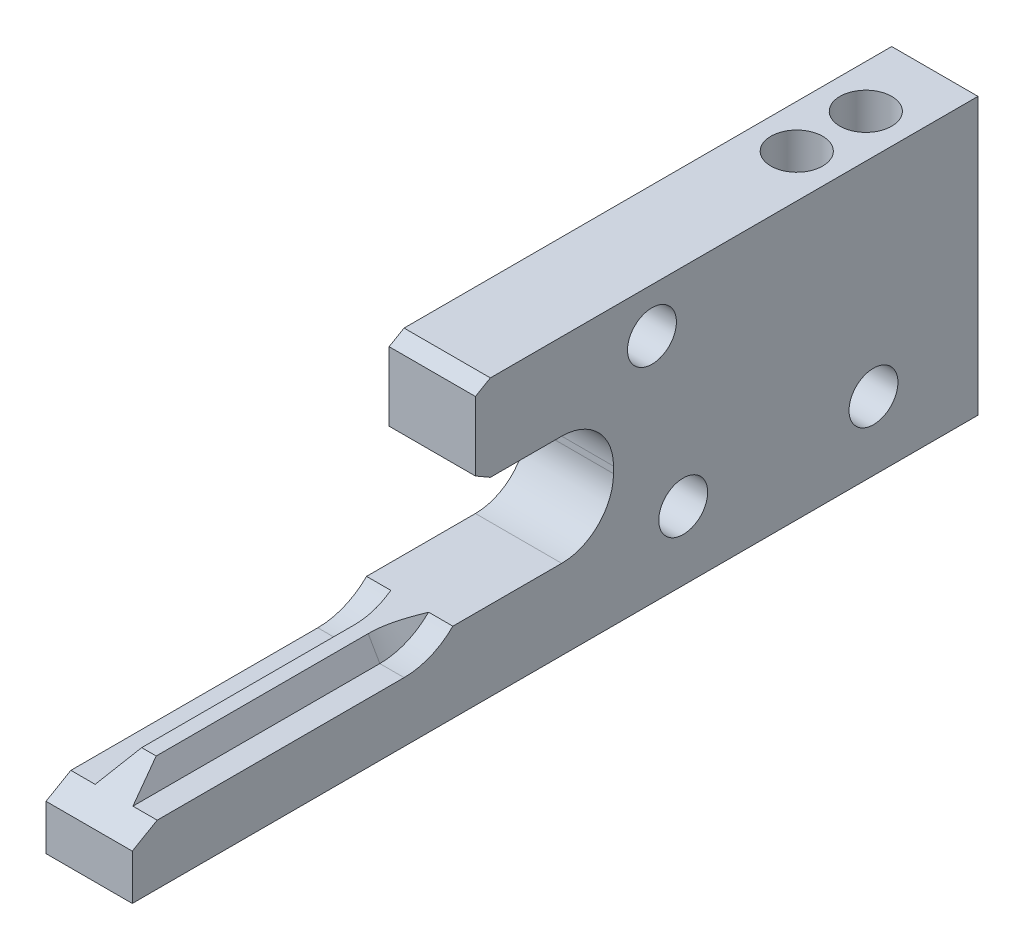
ISO-10303-21;
HEADER;
FILE_DESCRIPTION(('STEP AP214'),'2;1');
FILE_NAME('part.step','',(''),(''),'','','');
FILE_SCHEMA(('AUTOMOTIVE_DESIGN { 1 0 10303 214 1 1 1 1 }'));
ENDSEC;
DATA;
#1=APPLICATION_CONTEXT('core data for automotive mechanical design processes');
#2=APPLICATION_PROTOCOL_DEFINITION('international standard','automotive_design',2000,#1);
#3=PRODUCT_CONTEXT('',#1,'mechanical');
#4=PRODUCT('Part','Part','',(#3));
#5=PRODUCT_RELATED_PRODUCT_CATEGORY('part','',(#4));
#6=PRODUCT_DEFINITION_FORMATION('','',#4);
#7=PRODUCT_DEFINITION_CONTEXT('part definition',#1,'design');
#8=PRODUCT_DEFINITION('design','',#6,#7);
#9=PRODUCT_DEFINITION_SHAPE('','',#8);
#10=(LENGTH_UNIT() NAMED_UNIT(*) SI_UNIT(.MILLI.,.METRE.));
#11=(NAMED_UNIT(*) PLANE_ANGLE_UNIT() SI_UNIT($,.RADIAN.));
#12=(NAMED_UNIT(*) SI_UNIT($,.STERADIAN.) SOLID_ANGLE_UNIT());
#13=UNCERTAINTY_MEASURE_WITH_UNIT(LENGTH_MEASURE(1.E-05),#10,'distance_accuracy_value','');
#14=(GEOMETRIC_REPRESENTATION_CONTEXT(3) GLOBAL_UNCERTAINTY_ASSIGNED_CONTEXT((#13)) GLOBAL_UNIT_ASSIGNED_CONTEXT((#10,
#11,#12)) REPRESENTATION_CONTEXT('',''));
#15=CARTESIAN_POINT('',(0.,0.,0.));
#16=DIRECTION('',(0.,0.,1.));
#17=DIRECTION('',(1.,0.,0.));
#18=AXIS2_PLACEMENT_3D('',#15,#16,#17);
#19=CARTESIAN_POINT('',(15.875,14.6939,155.575));
#20=DIRECTION('',(0.,-1.,0.));
#21=DIRECTION('',(0.,0.,-1.));
#22=AXIS2_PLACEMENT_3D('',#19,#20,#21);
#23=PLANE('',#22);
#24=DIRECTION('',(0.,0.,1.));
#25=VECTOR('',#24,1.);
#26=CARTESIAN_POINT('',(6.604,14.6939,105.575));
#27=LINE('',#26,#25);
#28=CARTESIAN_POINT('',(6.604,14.6939,105.575));
#29=VERTEX_POINT('',#28);
#30=CARTESIAN_POINT('',(6.60400000000001,14.6939,144.576477371938));
#31=VERTEX_POINT('',#30);
#32=EDGE_CURVE('E726',#29,#31,#27,.T.);
#33=ORIENTED_EDGE('',*,*,#32,.T.);
#34=DIRECTION('',(1.,0.,0.));
#35=VECTOR('',#34,1.);
#36=CARTESIAN_POINT('',(0.,14.6939,144.576477371938));
#37=LINE('',#36,#35);
#38=CARTESIAN_POINT('',(9.271,14.6939,144.576477371938));
#39=VERTEX_POINT('',#38);
#40=EDGE_CURVE('E372',#31,#39,#37,.T.);
#41=ORIENTED_EDGE('',*,*,#40,.T.);
#42=DIRECTION('',(0.,0.,1.));
#43=VECTOR('',#42,1.);
#44=CARTESIAN_POINT('',(9.271,14.6939,105.575));
#45=LINE('',#44,#43);
#46=CARTESIAN_POINT('',(9.271,14.6939,105.575));
#47=VERTEX_POINT('',#46);
#48=EDGE_CURVE('E724',#47,#39,#45,.T.);
#49=ORIENTED_EDGE('',*,*,#48,.F.);
#50=CARTESIAN_POINT('',(16.3434941393958,14.6939,86.3304353971037));
#51=CARTESIAN_POINT('',(16.1054517664807,14.6939,86.7855798597903));
#52=CARTESIAN_POINT('',(15.8685486339507,14.6939,87.2413251005352));
#53=CARTESIAN_POINT('',(15.3976202622754,14.6939,88.154324569284));
#54=CARTESIAN_POINT('',(15.1635951498618,14.6939,88.6115788626214));
#55=CARTESIAN_POINT('',(14.6987226480085,14.6939,89.5284962898796));
#56=CARTESIAN_POINT('',(14.467880090142,14.6939,89.9881618773967));
#57=CARTESIAN_POINT('',(14.010555350619,14.6939,90.9096518370073));
#58=CARTESIAN_POINT('',(13.7840731043428,14.6939,91.371476176982));
#59=CARTESIAN_POINT('',(13.3217916243782,14.6939,92.3283690708705));
#60=CARTESIAN_POINT('',(13.0863653347386,14.6939,92.8236182730073));
#61=CARTESIAN_POINT('',(12.6235412772704,14.6939,93.817894843858));
#62=CARTESIAN_POINT('',(12.3961438566429,14.6939,94.3169223748318));
#63=CARTESIAN_POINT('',(11.952010980392,14.6939,95.3195379822649));
#64=CARTESIAN_POINT('',(11.7352723160888,14.6939,95.8231246315343));
#65=CARTESIAN_POINT('',(11.3159723297565,14.6939,96.8361720935029));
#66=CARTESIAN_POINT('',(11.1134096514921,14.6939,97.3456323388205));
#67=CARTESIAN_POINT('',(10.7983144421751,14.6939,98.1837116116901));
#68=CARTESIAN_POINT('',(10.6800017722808,14.6939,98.5101532601466));
#69=CARTESIAN_POINT('',(10.4528500570047,14.6939,99.1663062940015));
#70=CARTESIAN_POINT('',(10.3440102061598,14.6939,99.4960173987408));
#71=CARTESIAN_POINT('',(10.1378365669734,14.6939,100.159070790287));
#72=CARTESIAN_POINT('',(10.0405036492978,14.6939,100.492413349784));
#73=CARTESIAN_POINT('',(9.85977095270613,14.6939,101.162887883503));
#74=CARTESIAN_POINT('',(9.77637103109569,14.6939,101.500019818878));
#75=CARTESIAN_POINT('',(9.62812310629079,14.6939,102.169246626136));
#76=CARTESIAN_POINT('',(9.56285153636122,14.6939,102.501246662355));
#77=CARTESIAN_POINT('',(9.45057912040732,14.6939,103.168350853809));
#78=CARTESIAN_POINT('',(9.40357754113268,14.6939,103.503454883915));
#79=CARTESIAN_POINT('',(9.33004482338421,14.6939,104.175609512781));
#80=CARTESIAN_POINT('',(9.3034940881323,14.6939,104.512657935468));
#81=CARTESIAN_POINT('',(9.27218180838124,14.6939,105.187768517397));
#82=CARTESIAN_POINT('',(9.26741903074855,14.6939,105.525830618183));
#83=CARTESIAN_POINT('',(9.27930275906689,14.6939,106.167622191697));
#84=CARTESIAN_POINT('',(9.29384906959821,14.6939,106.471393050145));
#85=CARTESIAN_POINT('',(9.34012886324102,14.6939,107.077607427517));
#86=CARTESIAN_POINT('',(9.37186223490923,14.6939,107.380050955034));
#87=CARTESIAN_POINT('',(9.45126383323926,14.6939,107.983026524959));
#88=CARTESIAN_POINT('',(9.49894312162742,14.6939,108.283557092455));
#89=CARTESIAN_POINT('',(9.60854593138569,14.6939,108.881992063725));
#90=CARTESIAN_POINT('',(9.67046993011779,14.6939,109.179896379142));
#91=CARTESIAN_POINT('',(9.80884974523668,14.6939,109.782062409989));
#92=CARTESIAN_POINT('',(9.88569805881589,14.6939,110.086233189661));
#93=CARTESIAN_POINT('',(10.0506308319873,14.6939,110.691490262413));
#94=CARTESIAN_POINT('',(10.1387153878004,14.6939,110.992576529054));
#95=CARTESIAN_POINT('',(10.3243367933456,14.6939,111.591778918126));
#96=CARTESIAN_POINT('',(10.4218728400373,14.6939,111.889895290522));
#97=CARTESIAN_POINT('',(10.574115186197,14.6939,112.33501363906));
#98=CARTESIAN_POINT('',(10.6258515659768,14.6939,112.483041619903));
#99=CARTESIAN_POINT('',(10.7311399001807,14.6939,112.778450285213));
#100=CARTESIAN_POINT('',(10.7846918488178,14.6939,112.925830971743));
#101=CARTESIAN_POINT('',(10.9535586644632,14.6939,113.382537878622));
#102=CARTESIAN_POINT('',(11.0717180910607,14.6939,113.690814430242));
#103=CARTESIAN_POINT('',(11.3141298144179,14.6939,114.304969474873));
#104=CARTESIAN_POINT('',(11.4383824507938,14.6939,114.61084783311));
#105=CARTESIAN_POINT('',(11.6919847679599,14.6939,115.220548736705));
#106=CARTESIAN_POINT('',(11.8213354203943,14.6939,115.524370877106));
#107=CARTESIAN_POINT('',(12.0842935405807,14.6939,116.130170173938));
#108=CARTESIAN_POINT('',(12.2179011015661,14.6939,116.432147289786));
#109=CARTESIAN_POINT('',(12.6242800624897,14.6939,117.336141874688));
#110=CARTESIAN_POINT('',(12.9024090554513,14.6939,117.93575106326));
#111=CARTESIAN_POINT('',(13.4689046022364,14.6939,119.130006708118));
#112=CARTESIAN_POINT('',(13.7572701373196,14.6939,119.724653651013));
#113=CARTESIAN_POINT('',(14.3424458856195,14.6939,120.911847817826));
#114=CARTESIAN_POINT('',(14.639277554437,14.6939,121.504384443736));
#115=CARTESIAN_POINT('',(15.2387489252325,14.6939,122.686520883351));
#116=CARTESIAN_POINT('',(15.5413887495971,14.6939,123.276120634841));
#117=CARTESIAN_POINT('',(16.1510125463783,14.6939,124.452721950796));
#118=CARTESIAN_POINT('',(16.4579944512084,14.6939,125.039724587996));
#119=CARTESIAN_POINT('',(17.0754868791568,14.6939,126.211863211099));
#120=CARTESIAN_POINT('',(17.385997376622,14.6939,126.796999210532));
#121=CARTESIAN_POINT('',(18.2265667276517,14.6939,128.371843908391));
#122=CARTESIAN_POINT('',(18.7592549981493,14.6939,129.360148599985));
#123=CARTESIAN_POINT('',(19.8303791631326,14.6939,131.33380107874));
#124=CARTESIAN_POINT('',(20.3688158098285,14.6939,132.319148456759));
#125=CARTESIAN_POINT('',(21.4470019783699,14.6939,134.282352679942));
#126=CARTESIAN_POINT('',(21.9867295348616,14.6939,135.260221595784));
#127=CARTESIAN_POINT('',(22.7986150487096,14.6939,136.725658543039));
#128=CARTESIAN_POINT('',(23.0696059104641,14.6939,137.213873947031));
#129=CARTESIAN_POINT('',(23.6122747421494,14.6939,138.189922078901));
#130=CARTESIAN_POINT('',(23.8839527113472,14.6939,138.677754807187));
#131=CARTESIAN_POINT('',(24.1559291981345,14.6939,139.165421086488));
#132=B_SPLINE_CURVE_WITH_KNOTS('',3,(#50,#51,#52,#53,#54,#55,#56,#57,#58,#59,#60,#61,#62,#63,
#64,#65,#66,#67,#68,#69,#70,#71,#72,#73,#74,#75,#76,#77,#78,#79,#80,#81,#82,#83,#84,#85,#86,#87,
#88,#89,#90,#91,#92,#93,#94,#95,#96,#97,#98,#99,#100,#101,#102,#103,#104,#105,#106,#107,#108,
#109,#110,#111,#112,#113,#114,#115,#116,#117,#118,#119,#120,#121,#122,#123,#124,#125,#126,#127,
#128,#129,#130,#131),.UNSPECIFIED.,.F.,.F.,(4,2,2,2,2,2,2,2,2,2,2,2,2,2,2,2,2,2,2,2,2,2,2,2,2,2,
2,2,2,2,2,2,2,2,2,2,2,2,2,2,4),(0.,1.54090917195354,3.08188595556461,4.62498954429285,
6.16807024665801,7.81309232799242,9.45818545990249,11.1027802877931,12.7472175594096,
13.7887650909224,14.8302239741062,15.8717616083339,16.9132885750252,17.927911862955,
18.9424944256492,19.956103563,20.9696553323812,21.8815102854699,22.7933593260368,
23.7058422353952,24.6183557279038,25.559286947878,26.5002262260021,27.4410856277385,
27.9115018862325,28.381916645471,29.3722660174202,30.3626706511842,31.3532649703439,
32.3438810001244,34.3266476236101,36.3092174724153,38.2973592194643,40.2855429057825,
42.2728097741739,44.2600622043274,47.6281959828104,50.9967760402033,54.3475591099649,
56.0227043681855,57.6978478397403),.UNSPECIFIED.);
#133=CARTESIAN_POINT('',(11.4120457382628,14.6939,96.6061021056096));
#134=VERTEX_POINT('',#133);
#135=EDGE_CURVE('E422',#134,#47,#132,.T.);
#136=ORIENTED_EDGE('',*,*,#135,.F.);
#137=DIRECTION('',(1.,0.,0.));
#138=VECTOR('',#137,1.);
#139=CARTESIAN_POINT('',(15.875,14.6939,96.6061021056096));
#140=LINE('',#139,#138);
#141=CARTESIAN_POINT('',(15.875,14.6939,96.6061021056096));
#142=VERTEX_POINT('',#141);
#143=EDGE_CURVE('E207',#142,#134,#140,.F.);
#144=ORIENTED_EDGE('',*,*,#143,.F.);
#145=DIRECTION('',(0.,0.,1.));
#146=VECTOR('',#145,1.);
#147=CARTESIAN_POINT('',(15.875,14.6939,155.575));
#148=LINE('',#147,#146);
#149=CARTESIAN_POINT('',(15.875,14.6939,76.581));
#150=VERTEX_POINT('',#149);
#151=EDGE_CURVE('E185',#150,#142,#148,.T.);
#152=ORIENTED_EDGE('',*,*,#151,.F.);
#153=DIRECTION('',(-1.,0.,0.));
#154=VECTOR('',#153,1.);
#155=CARTESIAN_POINT('',(15.875,14.6939,76.581));
#156=LINE('',#155,#154);
#157=CARTESIAN_POINT('',(0.,14.6939,76.581));
#158=VERTEX_POINT('',#157);
#159=EDGE_CURVE('E193',#150,#158,#156,.T.);
#160=ORIENTED_EDGE('',*,*,#159,.T.);
#161=DIRECTION('',(0.,0.,1.));
#162=VECTOR('',#161,1.);
#163=CARTESIAN_POINT('',(0.,14.6939,155.575));
#164=LINE('',#163,#162);
#165=CARTESIAN_POINT('',(0.,14.6939,96.6061021056096));
#166=VERTEX_POINT('',#165);
#167=EDGE_CURVE('E234',#158,#166,#164,.T.);
#168=ORIENTED_EDGE('',*,*,#167,.T.);
#169=DIRECTION('',(1.,0.,0.));
#170=VECTOR('',#169,1.);
#171=CARTESIAN_POINT('',(15.875,14.6939,96.6061021056096));
#172=LINE('',#171,#170);
#173=CARTESIAN_POINT('',(4.46295426173719,14.6939,96.6061021056096));
#174=VERTEX_POINT('',#173);
#175=EDGE_CURVE('E310',#174,#166,#172,.F.);
#176=ORIENTED_EDGE('',*,*,#175,.F.);
#177=CARTESIAN_POINT('',(-0.468494139395891,14.6939,86.3304353971037));
#178=CARTESIAN_POINT('',(-0.230451766480791,14.6939,86.7855798597903));
#179=CARTESIAN_POINT('',(0.00645136604922203,14.6939,87.2413251005352));
#180=CARTESIAN_POINT('',(0.47737973772447,14.6939,88.154324569284));
#181=CARTESIAN_POINT('',(0.711404850138061,14.6939,88.6115788626214));
#182=CARTESIAN_POINT('',(1.17627735199139,14.6939,89.5284962898796));
#183=CARTESIAN_POINT('',(1.40711990985791,14.6939,89.9881618773966));
#184=CARTESIAN_POINT('',(1.86444464938095,14.6939,90.9096518370073));
#185=CARTESIAN_POINT('',(2.0909268956571,14.6939,91.371476176982));
#186=CARTESIAN_POINT('',(2.55320837562174,14.6939,92.3283690708705));
#187=CARTESIAN_POINT('',(2.78863466526133,14.6939,92.8236182730073));
#188=CARTESIAN_POINT('',(3.25145872272955,14.6939,93.817894843858));
#189=CARTESIAN_POINT('',(3.47885614335702,14.6939,94.3169223748317));
#190=CARTESIAN_POINT('',(3.9229890196079,14.6939,95.3195379822649));
#191=CARTESIAN_POINT('',(4.13972768391112,14.6939,95.8231246315343));
#192=CARTESIAN_POINT('',(4.55902767024343,14.6939,96.8361720935028));
#193=CARTESIAN_POINT('',(4.76159034850789,14.6939,97.3456323388205));
#194=CARTESIAN_POINT('',(5.07668555782483,14.6939,98.1837116116901));
#195=CARTESIAN_POINT('',(5.1949982277192,14.6939,98.5101532601466));
#196=CARTESIAN_POINT('',(5.42214994299523,14.6939,99.1663062940015));
#197=CARTESIAN_POINT('',(5.5309897938402,14.6939,99.4960173987407));
#198=CARTESIAN_POINT('',(5.73716343302655,14.6939,100.159070790287));
#199=CARTESIAN_POINT('',(5.8344963507022,14.6939,100.492413349784));
#200=CARTESIAN_POINT('',(6.01522904729385,14.6939,101.162887883503));
#201=CARTESIAN_POINT('',(6.09862896890429,14.6939,101.500019818878));
#202=CARTESIAN_POINT('',(6.24687689370919,14.6939,102.169246626136));
#203=CARTESIAN_POINT('',(6.31214846363876,14.6939,102.501246662355));
#204=CARTESIAN_POINT('',(6.42442087959267,14.6939,103.168350853809));
#205=CARTESIAN_POINT('',(6.47142245886731,14.6939,103.503454883915));
#206=CARTESIAN_POINT('',(6.54495517661578,14.6939,104.17560951278));
#207=CARTESIAN_POINT('',(6.57150591186769,14.6939,104.512657935468));
#208=CARTESIAN_POINT('',(6.60281819161876,14.6939,105.187768517396));
#209=CARTESIAN_POINT('',(6.60758096925145,14.6939,105.525830618183));
#210=CARTESIAN_POINT('',(6.59569724093312,14.6939,106.167622191697));
#211=CARTESIAN_POINT('',(6.58115093040179,14.6939,106.471393050145));
#212=CARTESIAN_POINT('',(6.53487113675899,14.6939,107.077607427517));
#213=CARTESIAN_POINT('',(6.50313776509078,14.6939,107.380050955034));
#214=CARTESIAN_POINT('',(6.42373616676075,14.6939,107.983026524959));
#215=CARTESIAN_POINT('',(6.3760568783726,14.6939,108.283557092454));
#216=CARTESIAN_POINT('',(6.26645406861432,14.6939,108.881992063725));
#217=CARTESIAN_POINT('',(6.20453006988222,14.6939,109.179896379142));
#218=CARTESIAN_POINT('',(6.06615025476334,14.6939,109.782062409988));
#219=CARTESIAN_POINT('',(5.98930194118412,14.6939,110.086233189661));
#220=CARTESIAN_POINT('',(5.82436916801272,14.6939,110.691490262413));
#221=CARTESIAN_POINT('',(5.73628461219963,14.6939,110.992576529054));
#222=CARTESIAN_POINT('',(5.55066320665439,14.6939,111.591778918126));
#223=CARTESIAN_POINT('',(5.45312715996276,14.6939,111.889895290522));
#224=CARTESIAN_POINT('',(5.30088481380299,14.6939,112.33501363906));
#225=CARTESIAN_POINT('',(5.24914843402319,14.6939,112.483041619902));
#226=CARTESIAN_POINT('',(5.14386009981934,14.6939,112.778450285213));
#227=CARTESIAN_POINT('',(5.0903081511822,14.6939,112.925830971743));
#228=CARTESIAN_POINT('',(4.92144133553688,14.6939,113.382537878621));
#229=CARTESIAN_POINT('',(4.80328190893932,14.6939,113.690814430242));
#230=CARTESIAN_POINT('',(4.56087018558211,14.6939,114.304969474873));
#231=CARTESIAN_POINT('',(4.43661754920625,14.6939,114.61084783311));
#232=CARTESIAN_POINT('',(4.18301523204016,14.6939,115.220548736705));
#233=CARTESIAN_POINT('',(4.05366457960574,14.6939,115.524370877106));
#234=CARTESIAN_POINT('',(3.79070645941939,14.6939,116.130170173937));
#235=CARTESIAN_POINT('',(3.65709889843399,14.6939,116.432147289785));
#236=CARTESIAN_POINT('',(3.25071993751033,14.6939,117.336141874688));
#237=CARTESIAN_POINT('',(2.97259094454876,14.6939,117.93575106326));
#238=CARTESIAN_POINT('',(2.40609539776371,14.6939,119.130006708118));
#239=CARTESIAN_POINT('',(2.11772986268048,14.6939,119.724653651012));
#240=CARTESIAN_POINT('',(1.53255411438064,14.6939,120.911847817826));
#241=CARTESIAN_POINT('',(1.23572244556308,14.6939,121.504384443735));
#242=CARTESIAN_POINT('',(0.636251074767604,14.6939,122.68652088335));
#243=CARTESIAN_POINT('',(0.333611250403015,14.6939,123.276120634841));
#244=CARTESIAN_POINT('',(-0.276012546378111,14.6939,124.452721950795));
#245=CARTESIAN_POINT('',(-0.582994451208284,14.6939,125.039724587995));
#246=CARTESIAN_POINT('',(-1.20048687915659,14.6939,126.211863211098));
#247=CARTESIAN_POINT('',(-1.51099737662179,14.6939,126.796999210532));
#248=CARTESIAN_POINT('',(-2.35156672765154,14.6939,128.37184390839));
#249=CARTESIAN_POINT('',(-2.8842549981491,14.6939,129.360148599984));
#250=CARTESIAN_POINT('',(-3.95537916313239,14.6939,131.333801078739));
#251=CARTESIAN_POINT('',(-4.49381580982826,14.6939,132.319148456758));
#252=CARTESIAN_POINT('',(-5.57200197836965,14.6939,134.282352679942));
#253=CARTESIAN_POINT('',(-6.11172953486135,14.6939,135.260221595783));
#254=CARTESIAN_POINT('',(-6.92361504870934,14.6939,136.725658543038));
#255=CARTESIAN_POINT('',(-7.19460591046379,14.6939,137.21387394703));
#256=CARTESIAN_POINT('',(-7.73727474214913,14.6939,138.1899220789));
#257=CARTESIAN_POINT('',(-8.00895271134688,14.6939,138.677754807186));
#258=CARTESIAN_POINT('',(-8.28092919813421,14.6939,139.165421086487));
#259=B_SPLINE_CURVE_WITH_KNOTS('',3,(#177,#178,#179,#180,#181,#182,#183,#184,#185,#186,#187,
#188,#189,#190,#191,#192,#193,#194,#195,#196,#197,#198,#199,#200,#201,#202,#203,#204,#205,#206,
#207,#208,#209,#210,#211,#212,#213,#214,#215,#216,#217,#218,#219,#220,#221,#222,#223,#224,#225,
#226,#227,#228,#229,#230,#231,#232,#233,#234,#235,#236,#237,#238,#239,#240,#241,#242,#243,#244,
#245,#246,#247,#248,#249,#250,#251,#252,#253,#254,#255,#256,#257,#258),.UNSPECIFIED.,.F.,.F.,(4,
2,2,2,2,2,2,2,2,2,2,2,2,2,2,2,2,2,2,2,2,2,2,2,2,2,2,2,2,2,2,2,2,2,2,2,2,2,2,2,4),(0.,
1.54090917195353,3.0818859555646,4.62498954429284,6.168070246658,7.81309232799238,
9.45818545990247,11.1027802877931,12.7472175594096,13.7887650909224,14.8302239741061,
15.8717616083339,16.9132885750252,17.927911862955,18.9424944256492,19.9561035629999,
20.9696553323811,21.8815102854698,22.7933593260367,23.7058422353951,24.6183557279037,
25.559286947878,26.500226226002,27.4410856277384,27.9115018862323,28.3819166454708,
29.37226601742,30.362670651184,31.3532649703437,32.3438810001242,34.3266476236098,
36.3092174724149,38.2973592194639,40.285542905782,42.2728097741733,44.2600622043268,
47.6281959828098,50.9967760402025,54.347559109964,56.0227043681846,57.6978478397393),.UNSPECIFIED.);
#260=EDGE_CURVE('E431',#29,#174,#259,.F.);
#261=ORIENTED_EDGE('',*,*,#260,.F.);
#262=EDGE_LOOP('',(#33,#41,#49,#136,#144,#152,#160,#168,#176,#261));
#263=FACE_BOUND('',#262,.T.);
#264=ADVANCED_FACE('F78',(#263),#23,.F.);
#265=CARTESIAN_POINT('',(15.875,24.2189,76.581));
#266=DIRECTION('',(1.,0.,0.));
#267=DIRECTION('',(0.,0.,-1.));
#268=AXIS2_PLACEMENT_3D('',#265,#266,#267);
#269=PLANE('',#268);
#270=DIRECTION('',(0.,0.499999999999996,-0.866025403784441));
#271=VECTOR('',#270,1.);
#272=CARTESIAN_POINT('',(15.875,8.34390000000003,155.575));
#273=LINE('',#272,#271);
#274=CARTESIAN_POINT('',(15.875,8.34390000000003,155.575));
#275=VERTEX_POINT('',#274);
#276=CARTESIAN_POINT('',(15.875,10.9855,150.999614586726));
#277=VERTEX_POINT('',#276);
#278=EDGE_CURVE('E366',#275,#277,#273,.T.);
#279=ORIENTED_EDGE('',*,*,#278,.F.);
#280=DIRECTION('',(0.,-1.,0.));
#281=VECTOR('',#280,1.);
#282=CARTESIAN_POINT('',(15.875,0.,155.575));
#283=LINE('',#282,#281);
#284=CARTESIAN_POINT('',(15.875,0.,155.575));
#285=VERTEX_POINT('',#284);
#286=EDGE_CURVE('E208',#275,#285,#283,.T.);
#287=ORIENTED_EDGE('',*,*,#286,.T.);
#288=DIRECTION('',(0.,0.,-1.));
#289=VECTOR('',#288,1.);
#290=CARTESIAN_POINT('',(15.875,0.,0.));
#291=LINE('',#290,#289);
#292=CARTESIAN_POINT('',(15.875,0.,0.));
#293=VERTEX_POINT('',#292);
#294=EDGE_CURVE('E101',#285,#293,#291,.T.);
#295=ORIENTED_EDGE('',*,*,#294,.T.);
#296=DIRECTION('',(0.,1.,0.));
#297=VECTOR('',#296,1.);
#298=CARTESIAN_POINT('',(15.875,50.8,0.));
#299=LINE('',#298,#297);
#300=CARTESIAN_POINT('',(15.875,50.8,0.));
#301=VERTEX_POINT('',#300);
#302=EDGE_CURVE('E239',#293,#301,#299,.T.);
#303=ORIENTED_EDGE('',*,*,#302,.T.);
#304=DIRECTION('',(0.,0.,1.));
#305=VECTOR('',#304,1.);
#306=CARTESIAN_POINT('',(15.875,50.8,89.7063693429844));
#307=LINE('',#306,#305);
#308=CARTESIAN_POINT('',(15.875,50.8,89.7063693429844));
#309=VERTEX_POINT('',#308);
#310=EDGE_CURVE('E152',#301,#309,#307,.T.);
#311=ORIENTED_EDGE('',*,*,#310,.T.);
#312=DIRECTION('',(0.,-0.500000000000001,0.866025403784438));
#313=VECTOR('',#312,1.);
#314=CARTESIAN_POINT('',(15.875,49.2125,92.456));
#315=LINE('',#314,#313);
#316=CARTESIAN_POINT('',(15.875,49.2125,92.456));
#317=VERTEX_POINT('',#316);
#318=EDGE_CURVE('E282',#309,#317,#315,.T.);
#319=ORIENTED_EDGE('',*,*,#318,.T.);
#320=DIRECTION('',(0.,-1.,0.));
#321=VECTOR('',#320,1.);
#322=CARTESIAN_POINT('',(15.875,36.5379,92.456));
#323=LINE('',#322,#321);
#324=CARTESIAN_POINT('',(15.875,36.5379,92.456));
#325=VERTEX_POINT('',#324);
#326=EDGE_CURVE('E279',#317,#325,#323,.T.);
#327=ORIENTED_EDGE('',*,*,#326,.T.);
#328=DIRECTION('',(0.,-0.499999999999999,-0.866025403784439));
#329=VECTOR('',#328,1.);
#330=CARTESIAN_POINT('',(15.875,34.9504,89.7063693429844));
#331=LINE('',#330,#329);
#332=CARTESIAN_POINT('',(15.875,34.9504,89.7063693429844));
#333=VERTEX_POINT('',#332);
#334=EDGE_CURVE('E281',#325,#333,#331,.T.);
#335=ORIENTED_EDGE('',*,*,#334,.T.);
#336=DIRECTION('',(0.,0.,-1.));
#337=VECTOR('',#336,1.);
#338=CARTESIAN_POINT('',(15.875,34.9504,76.581));
#339=LINE('',#338,#337);
#340=CARTESIAN_POINT('',(15.875,34.9504,76.581));
#341=VERTEX_POINT('',#340);
#342=EDGE_CURVE('E284',#333,#341,#339,.T.);
#343=ORIENTED_EDGE('',*,*,#342,.T.);
#344=CARTESIAN_POINT('',(15.875,25.4254,76.581));
#345=DIRECTION('',(-1.,0.,0.));
#346=DIRECTION('',(0.,0.,-1.));
#347=AXIS2_PLACEMENT_3D('',#344,#345,#346);
#348=CIRCLE('',#347,9.525);
#349=CARTESIAN_POINT('',(15.875,25.4254,67.056));
#350=VERTEX_POINT('',#349);
#351=EDGE_CURVE('E290',#341,#350,#348,.T.);
#352=ORIENTED_EDGE('',*,*,#351,.T.);
#353=DIRECTION('',(0.,-1.,0.));
#354=VECTOR('',#353,1.);
#355=CARTESIAN_POINT('',(15.875,24.2189,67.056));
#356=LINE('',#355,#354);
#357=CARTESIAN_POINT('',(15.875,24.2189,67.056));
#358=VERTEX_POINT('',#357);
#359=EDGE_CURVE('E187',#350,#358,#356,.T.);
#360=ORIENTED_EDGE('',*,*,#359,.T.);
#361=CARTESIAN_POINT('',(15.875,24.2189,76.581));
#362=DIRECTION('',(-1.,0.,0.));
#363=DIRECTION('',(0.,0.,-1.));
#364=AXIS2_PLACEMENT_3D('',#361,#362,#363);
#365=CIRCLE('',#364,9.525);
#366=EDGE_CURVE('E177',#358,#150,#365,.T.);
#367=ORIENTED_EDGE('',*,*,#366,.T.);
#368=ORIENTED_EDGE('',*,*,#151,.T.);
#369=CARTESIAN_POINT('',(15.875,23.6855,105.575));
#370=DIRECTION('',(1.,0.,0.));
#371=DIRECTION('',(0.,0.,-1.));
#372=AXIS2_PLACEMENT_3D('',#369,#370,#371);
#373=CIRCLE('',#372,12.7);
#374=CARTESIAN_POINT('',(15.875,10.9855,105.575));
#375=VERTEX_POINT('',#374);
#376=EDGE_CURVE('E413',#375,#142,#373,.T.);
#377=ORIENTED_EDGE('',*,*,#376,.F.);
#378=DIRECTION('',(0.,0.,1.));
#379=VECTOR('',#378,1.);
#380=CARTESIAN_POINT('',(15.875,10.9855,105.575));
#381=LINE('',#380,#379);
#382=EDGE_CURVE('E219',#375,#277,#381,.T.);
#383=ORIENTED_EDGE('',*,*,#382,.T.);
#384=EDGE_LOOP('',(#279,#287,#295,#303,#311,#319,#327,#335,#343,#352,#360,#367,#368,#377,#383));
#385=FACE_BOUND('',#384,.T.);
#386=CARTESIAN_POINT('',(15.875,42.60999987,59.980000078));
#387=DIRECTION('',(1.,0.,0.));
#388=DIRECTION('',(0.,0.,-1.));
#389=AXIS2_PLACEMENT_3D('',#386,#387,#388);
#390=CIRCLE('',#389,4.5);
#391=CARTESIAN_POINT('',(15.875,42.60999987,55.480000078));
#392=VERTEX_POINT('',#391);
#393=EDGE_CURVE('E383',#392,#392,#390,.T.);
#394=ORIENTED_EDGE('',*,*,#393,.F.);
#395=EDGE_LOOP('',(#394));
#396=FACE_BOUND('',#395,.T.);
#397=CARTESIAN_POINT('',(15.875,12.609999896,19.230000076));
#398=DIRECTION('',(1.,0.,0.));
#399=DIRECTION('',(0.,0.,-1.));
#400=AXIS2_PLACEMENT_3D('',#397,#398,#399);
#401=CIRCLE('',#400,4.5);
#402=CARTESIAN_POINT('',(15.875,12.609999896,14.730000076));
#403=VERTEX_POINT('',#402);
#404=EDGE_CURVE('E387',#403,#403,#401,.T.);
#405=ORIENTED_EDGE('',*,*,#404,.F.);
#406=EDGE_LOOP('',(#405));
#407=FACE_BOUND('',#406,.T.);
#408=CARTESIAN_POINT('',(15.875,12.609999896,54.230000076));
#409=DIRECTION('',(1.,0.,0.));
#410=DIRECTION('',(0.,0.,-1.));
#411=AXIS2_PLACEMENT_3D('',#408,#409,#410);
#412=CIRCLE('',#411,4.5);
#413=CARTESIAN_POINT('',(15.875,12.609999896,49.730000076));
#414=VERTEX_POINT('',#413);
#415=EDGE_CURVE('E393',#414,#414,#412,.T.);
#416=ORIENTED_EDGE('',*,*,#415,.F.);
#417=EDGE_LOOP('',(#416));
#418=FACE_BOUND('',#417,.T.);
#419=ADVANCED_FACE('F180',(#385,#396,#407,#418),#269,.T.);
#420=CARTESIAN_POINT('',(0.,24.2189,76.581));
#421=DIRECTION('',(1.,0.,0.));
#422=DIRECTION('',(0.,0.,-1.));
#423=AXIS2_PLACEMENT_3D('',#420,#421,#422);
#424=PLANE('',#423);
#425=CARTESIAN_POINT('',(0.,42.60999987,59.980000078));
#426=DIRECTION('',(1.,0.,0.));
#427=DIRECTION('',(0.,0.,-1.));
#428=AXIS2_PLACEMENT_3D('',#425,#426,#427);
#429=CIRCLE('',#428,4.5);
#430=CARTESIAN_POINT('',(0.,42.60999987,55.480000078));
#431=VERTEX_POINT('',#430);
#432=EDGE_CURVE('E384',#431,#431,#429,.T.);
#433=ORIENTED_EDGE('',*,*,#432,.T.);
#434=EDGE_LOOP('',(#433));
#435=FACE_BOUND('',#434,.T.);
#436=CARTESIAN_POINT('',(0.,12.609999896,19.230000076));
#437=DIRECTION('',(1.,0.,0.));
#438=DIRECTION('',(0.,0.,-1.));
#439=AXIS2_PLACEMENT_3D('',#436,#437,#438);
#440=CIRCLE('',#439,4.5);
#441=CARTESIAN_POINT('',(0.,12.609999896,14.730000076));
#442=VERTEX_POINT('',#441);
#443=EDGE_CURVE('E390',#442,#442,#440,.T.);
#444=ORIENTED_EDGE('',*,*,#443,.T.);
#445=EDGE_LOOP('',(#444));
#446=FACE_BOUND('',#445,.T.);
#447=CARTESIAN_POINT('',(0.,12.609999896,54.230000076));
#448=DIRECTION('',(1.,0.,0.));
#449=DIRECTION('',(0.,0.,-1.));
#450=AXIS2_PLACEMENT_3D('',#447,#448,#449);
#451=CIRCLE('',#450,4.5);
#452=CARTESIAN_POINT('',(0.,12.609999896,49.730000076));
#453=VERTEX_POINT('',#452);
#454=EDGE_CURVE('E396',#453,#453,#451,.T.);
#455=ORIENTED_EDGE('',*,*,#454,.T.);
#456=EDGE_LOOP('',(#455));
#457=FACE_BOUND('',#456,.T.);
#458=DIRECTION('',(0.,-1.,0.));
#459=VECTOR('',#458,1.);
#460=CARTESIAN_POINT('',(0.,0.,155.575));
#461=LINE('',#460,#459);
#462=CARTESIAN_POINT('',(0.,8.34390000000003,155.575));
#463=VERTEX_POINT('',#462);
#464=CARTESIAN_POINT('',(0.,0.,155.575));
#465=VERTEX_POINT('',#464);
#466=EDGE_CURVE('E236',#463,#465,#461,.T.);
#467=ORIENTED_EDGE('',*,*,#466,.F.);
#468=DIRECTION('',(0.,0.499999999999996,-0.866025403784441));
#469=VECTOR('',#468,1.);
#470=CARTESIAN_POINT('',(0.,8.34390000000003,155.575));
#471=LINE('',#470,#469);
#472=CARTESIAN_POINT('',(0.,10.9855,150.999614586726));
#473=VERTEX_POINT('',#472);
#474=EDGE_CURVE('E359',#463,#473,#471,.T.);
#475=ORIENTED_EDGE('',*,*,#474,.T.);
#476=DIRECTION('',(0.,0.,1.));
#477=VECTOR('',#476,1.);
#478=CARTESIAN_POINT('',(0.,10.9855,105.575));
#479=LINE('',#478,#477);
#480=CARTESIAN_POINT('',(0.,10.9855,105.575));
#481=VERTEX_POINT('',#480);
#482=EDGE_CURVE('E736',#481,#473,#479,.T.);
#483=ORIENTED_EDGE('',*,*,#482,.F.);
#484=CARTESIAN_POINT('',(0.,23.6855,105.575));
#485=DIRECTION('',(1.,0.,0.));
#486=DIRECTION('',(0.,0.,-1.));
#487=AXIS2_PLACEMENT_3D('',#484,#485,#486);
#488=CIRCLE('',#487,12.7);
#489=EDGE_CURVE('E305',#481,#166,#488,.T.);
#490=ORIENTED_EDGE('',*,*,#489,.T.);
#491=ORIENTED_EDGE('',*,*,#167,.F.);
#492=CARTESIAN_POINT('',(0.,24.2189,76.581));
#493=DIRECTION('',(-1.,0.,0.));
#494=DIRECTION('',(0.,0.,-1.));
#495=AXIS2_PLACEMENT_3D('',#492,#493,#494);
#496=CIRCLE('',#495,9.525);
#497=CARTESIAN_POINT('',(0.,24.2189,67.056));
#498=VERTEX_POINT('',#497);
#499=EDGE_CURVE('E196',#498,#158,#496,.T.);
#500=ORIENTED_EDGE('',*,*,#499,.F.);
#501=DIRECTION('',(0.,-1.,0.));
#502=VECTOR('',#501,1.);
#503=CARTESIAN_POINT('',(0.,24.2189,67.056));
#504=LINE('',#503,#502);
#505=CARTESIAN_POINT('',(0.,25.4254,67.056));
#506=VERTEX_POINT('',#505);
#507=EDGE_CURVE('E231',#506,#498,#504,.T.);
#508=ORIENTED_EDGE('',*,*,#507,.F.);
#509=CARTESIAN_POINT('',(0.,25.4254,76.581));
#510=DIRECTION('',(-1.,0.,0.));
#511=DIRECTION('',(0.,0.,-1.));
#512=AXIS2_PLACEMENT_3D('',#509,#510,#511);
#513=CIRCLE('',#512,9.525);
#514=CARTESIAN_POINT('',(0.,34.9504,76.581));
#515=VERTEX_POINT('',#514);
#516=EDGE_CURVE('E229',#515,#506,#513,.T.);
#517=ORIENTED_EDGE('',*,*,#516,.F.);
#518=DIRECTION('',(0.,0.,-1.));
#519=VECTOR('',#518,1.);
#520=CARTESIAN_POINT('',(0.,34.9504,76.581));
#521=LINE('',#520,#519);
#522=CARTESIAN_POINT('',(0.,34.9504,89.7063693429844));
#523=VERTEX_POINT('',#522);
#524=EDGE_CURVE('E227',#523,#515,#521,.T.);
#525=ORIENTED_EDGE('',*,*,#524,.F.);
#526=DIRECTION('',(0.,-0.499999999999999,-0.866025403784439));
#527=VECTOR('',#526,1.);
#528=CARTESIAN_POINT('',(0.,34.9504,89.7063693429844));
#529=LINE('',#528,#527);
#530=CARTESIAN_POINT('',(0.,36.5379,92.456));
#531=VERTEX_POINT('',#530);
#532=EDGE_CURVE('E225',#531,#523,#529,.T.);
#533=ORIENTED_EDGE('',*,*,#532,.F.);
#534=DIRECTION('',(0.,-1.,0.));
#535=VECTOR('',#534,1.);
#536=CARTESIAN_POINT('',(0.,36.5379,92.456));
#537=LINE('',#536,#535);
#538=CARTESIAN_POINT('',(0.,49.2125,92.456));
#539=VERTEX_POINT('',#538);
#540=EDGE_CURVE('E223',#539,#531,#537,.T.);
#541=ORIENTED_EDGE('',*,*,#540,.F.);
#542=DIRECTION('',(0.,-0.500000000000001,0.866025403784438));
#543=VECTOR('',#542,1.);
#544=CARTESIAN_POINT('',(0.,49.2125,92.456));
#545=LINE('',#544,#543);
#546=CARTESIAN_POINT('',(0.,50.8,89.7063693429844));
#547=VERTEX_POINT('',#546);
#548=EDGE_CURVE('E221',#547,#539,#545,.T.);
#549=ORIENTED_EDGE('',*,*,#548,.F.);
#550=DIRECTION('',(0.,0.,1.));
#551=VECTOR('',#550,1.);
#552=CARTESIAN_POINT('',(0.,50.8,89.7063693429844));
#553=LINE('',#552,#551);
#554=CARTESIAN_POINT('',(0.,50.8,0.));
#555=VERTEX_POINT('',#554);
#556=EDGE_CURVE('E218',#555,#547,#553,.T.);
#557=ORIENTED_EDGE('',*,*,#556,.F.);
#558=DIRECTION('',(0.,1.,0.));
#559=VECTOR('',#558,1.);
#560=CARTESIAN_POINT('',(0.,50.8,0.));
#561=LINE('',#560,#559);
#562=CARTESIAN_POINT('',(0.,0.,0.));
#563=VERTEX_POINT('',#562);
#564=EDGE_CURVE('E215',#563,#555,#561,.T.);
#565=ORIENTED_EDGE('',*,*,#564,.F.);
#566=DIRECTION('',(0.,0.,-1.));
#567=VECTOR('',#566,1.);
#568=CARTESIAN_POINT('',(0.,0.,0.));
#569=LINE('',#568,#567);
#570=EDGE_CURVE('E143',#465,#563,#569,.T.);
#571=ORIENTED_EDGE('',*,*,#570,.F.);
#572=EDGE_LOOP('',(#467,#475,#483,#490,#491,#500,#508,#517,#525,#533,#541,#549,#557,#565,#571));
#573=FACE_BOUND('',#572,.T.);
#574=ADVANCED_FACE('F267',(#435,#446,#457,#573),#424,.F.);
#575=CARTESIAN_POINT('',(15.875,50.8,0.));
#576=DIRECTION('',(0.,0.,1.));
#577=DIRECTION('',(0.,-1.,0.));
#578=AXIS2_PLACEMENT_3D('',#575,#576,#577);
#579=PLANE('',#578);
#580=ORIENTED_EDGE('',*,*,#564,.T.);
#581=DIRECTION('',(-1.,0.,0.));
#582=VECTOR('',#581,1.);
#583=CARTESIAN_POINT('',(15.875,50.8,0.));
#584=LINE('',#583,#582);
#585=EDGE_CURVE('E86',#301,#555,#584,.T.);
#586=ORIENTED_EDGE('',*,*,#585,.F.);
#587=ORIENTED_EDGE('',*,*,#302,.F.);
#588=DIRECTION('',(-1.,0.,0.));
#589=VECTOR('',#588,1.);
#590=CARTESIAN_POINT('',(15.875,0.,0.));
#591=LINE('',#590,#589);
#592=EDGE_CURVE('E214',#293,#563,#591,.T.);
#593=ORIENTED_EDGE('',*,*,#592,.T.);
#594=EDGE_LOOP('',(#580,#586,#587,#593));
#595=FACE_BOUND('',#594,.T.);
#596=ADVANCED_FACE('F80',(#595),#579,.F.);
#597=CARTESIAN_POINT('',(15.875,50.8,89.7063693429844));
#598=DIRECTION('',(0.,-1.,0.));
#599=DIRECTION('',(0.,0.,-1.));
#600=AXIS2_PLACEMENT_3D('',#597,#598,#599);
#601=PLANE('',#600);
#602=CARTESIAN_POINT('',(7.9375,50.8,25.4));
#603=DIRECTION('',(0.,1.,0.));
#604=DIRECTION('',(0.,0.,1.));
#605=AXIS2_PLACEMENT_3D('',#602,#603,#604);
#606=CIRCLE('',#605,4.7625);
#607=CARTESIAN_POINT('',(7.9375,50.8,30.1625));
#608=VERTEX_POINT('',#607);
#609=EDGE_CURVE('E399',#608,#608,#606,.T.);
#610=ORIENTED_EDGE('',*,*,#609,.F.);
#611=EDGE_LOOP('',(#610));
#612=FACE_BOUND('',#611,.T.);
#613=CARTESIAN_POINT('',(7.9375,50.8,12.7));
#614=DIRECTION('',(0.,1.,0.));
#615=DIRECTION('',(0.,0.,1.));
#616=AXIS2_PLACEMENT_3D('',#613,#614,#615);
#617=CIRCLE('',#616,4.7625);
#618=CARTESIAN_POINT('',(7.9375,50.8,17.4625));
#619=VERTEX_POINT('',#618);
#620=EDGE_CURVE('E407',#619,#619,#617,.T.);
#621=ORIENTED_EDGE('',*,*,#620,.F.);
#622=EDGE_LOOP('',(#621));
#623=FACE_BOUND('',#622,.T.);
#624=ORIENTED_EDGE('',*,*,#556,.T.);
#625=DIRECTION('',(-1.,0.,0.));
#626=VECTOR('',#625,1.);
#627=CARTESIAN_POINT('',(15.875,50.8,89.7063693429844));
#628=LINE('',#627,#626);
#629=EDGE_CURVE('E258',#309,#547,#628,.T.);
#630=ORIENTED_EDGE('',*,*,#629,.F.);
#631=ORIENTED_EDGE('',*,*,#310,.F.);
#632=ORIENTED_EDGE('',*,*,#585,.T.);
#633=EDGE_LOOP('',(#624,#630,#631,#632));
#634=FACE_BOUND('',#633,.T.);
#635=ADVANCED_FACE('F261',(#612,#623,#634),#601,.F.);
#636=CARTESIAN_POINT('',(15.875,49.2125,92.456));
#637=DIRECTION('',(0.,-0.866025403784438,-0.500000000000001));
#638=DIRECTION('',(0.,0.500000000000001,-0.866025403784438));
#639=AXIS2_PLACEMENT_3D('',#636,#637,#638);
#640=PLANE('',#639);
#641=ORIENTED_EDGE('',*,*,#548,.T.);
#642=DIRECTION('',(-1.,0.,0.));
#643=VECTOR('',#642,1.);
#644=CARTESIAN_POINT('',(15.875,49.2125,92.456));
#645=LINE('',#644,#643);
#646=EDGE_CURVE('E255',#317,#539,#645,.T.);
#647=ORIENTED_EDGE('',*,*,#646,.F.);
#648=ORIENTED_EDGE('',*,*,#318,.F.);
#649=ORIENTED_EDGE('',*,*,#629,.T.);
#650=EDGE_LOOP('',(#641,#647,#648,#649));
#651=FACE_BOUND('',#650,.T.);
#652=ADVANCED_FACE('F273',(#651),#640,.F.);
#653=CARTESIAN_POINT('',(15.875,36.5379,92.456));
#654=DIRECTION('',(0.,0.,-1.));
#655=DIRECTION('',(0.,1.,0.));
#656=AXIS2_PLACEMENT_3D('',#653,#654,#655);
#657=PLANE('',#656);
#658=ORIENTED_EDGE('',*,*,#540,.T.);
#659=DIRECTION('',(-1.,0.,0.));
#660=VECTOR('',#659,1.);
#661=CARTESIAN_POINT('',(15.875,36.5379,92.456));
#662=LINE('',#661,#660);
#663=EDGE_CURVE('E252',#325,#531,#662,.T.);
#664=ORIENTED_EDGE('',*,*,#663,.F.);
#665=ORIENTED_EDGE('',*,*,#326,.F.);
#666=ORIENTED_EDGE('',*,*,#646,.T.);
#667=EDGE_LOOP('',(#658,#664,#665,#666));
#668=FACE_BOUND('',#667,.T.);
#669=ADVANCED_FACE('F277',(#668),#657,.F.);
#670=CARTESIAN_POINT('',(15.875,34.9504,89.7063693429844));
#671=DIRECTION('',(0.,0.866025403784439,-0.499999999999999));
#672=DIRECTION('',(0.,0.499999999999999,0.866025403784439));
#673=AXIS2_PLACEMENT_3D('',#670,#671,#672);
#674=PLANE('',#673);
#675=ORIENTED_EDGE('',*,*,#532,.T.);
#676=DIRECTION('',(-1.,0.,0.));
#677=VECTOR('',#676,1.);
#678=CARTESIAN_POINT('',(15.875,34.9504,89.7063693429844));
#679=LINE('',#678,#677);
#680=EDGE_CURVE('E249',#333,#523,#679,.T.);
#681=ORIENTED_EDGE('',*,*,#680,.F.);
#682=ORIENTED_EDGE('',*,*,#334,.F.);
#683=ORIENTED_EDGE('',*,*,#663,.T.);
#684=EDGE_LOOP('',(#675,#681,#682,#683));
#685=FACE_BOUND('',#684,.T.);
#686=ADVANCED_FACE('F521',(#685),#674,.F.);
#687=CARTESIAN_POINT('',(15.875,34.9504,76.581));
#688=DIRECTION('',(0.,1.,0.));
#689=DIRECTION('',(0.,0.,1.));
#690=AXIS2_PLACEMENT_3D('',#687,#688,#689);
#691=PLANE('',#690);
#692=ORIENTED_EDGE('',*,*,#524,.T.);
#693=DIRECTION('',(-1.,0.,0.));
#694=VECTOR('',#693,1.);
#695=CARTESIAN_POINT('',(15.875,34.9504,76.581));
#696=LINE('',#695,#694);
#697=EDGE_CURVE('E246',#341,#515,#696,.T.);
#698=ORIENTED_EDGE('',*,*,#697,.F.);
#699=ORIENTED_EDGE('',*,*,#342,.F.);
#700=ORIENTED_EDGE('',*,*,#680,.T.);
#701=EDGE_LOOP('',(#692,#698,#699,#700));
#702=FACE_BOUND('',#701,.T.);
#703=ADVANCED_FACE('F528',(#702),#691,.F.);
#704=CARTESIAN_POINT('',(15.875,25.4254,76.581));
#705=DIRECTION('',(-1.,0.,0.));
#706=DIRECTION('',(0.,0.,1.));
#707=AXIS2_PLACEMENT_3D('',#704,#705,#706);
#708=CYLINDRICAL_SURFACE('',#707,9.525);
#709=ORIENTED_EDGE('',*,*,#516,.T.);
#710=DIRECTION('',(-1.,0.,0.));
#711=VECTOR('',#710,1.);
#712=CARTESIAN_POINT('',(15.875,25.4254,67.056));
#713=LINE('',#712,#711);
#714=EDGE_CURVE('E243',#350,#506,#713,.T.);
#715=ORIENTED_EDGE('',*,*,#714,.F.);
#716=ORIENTED_EDGE('',*,*,#351,.F.);
#717=ORIENTED_EDGE('',*,*,#697,.T.);
#718=EDGE_LOOP('',(#709,#715,#716,#717));
#719=FACE_BOUND('',#718,.T.);
#720=ADVANCED_FACE('F296',(#719),#708,.F.);
#721=CARTESIAN_POINT('',(15.875,24.2189,67.056));
#722=DIRECTION('',(0.,0.,-1.));
#723=DIRECTION('',(-1.,0.,0.));
#724=AXIS2_PLACEMENT_3D('',#721,#722,#723);
#725=PLANE('',#724);
#726=ORIENTED_EDGE('',*,*,#507,.T.);
#727=DIRECTION('',(-1.,0.,0.));
#728=VECTOR('',#727,1.);
#729=CARTESIAN_POINT('',(15.875,24.2189,67.056));
#730=LINE('',#729,#728);
#731=EDGE_CURVE('E200',#358,#498,#730,.T.);
#732=ORIENTED_EDGE('',*,*,#731,.F.);
#733=ORIENTED_EDGE('',*,*,#359,.F.);
#734=ORIENTED_EDGE('',*,*,#714,.T.);
#735=EDGE_LOOP('',(#726,#732,#733,#734));
#736=FACE_BOUND('',#735,.T.);
#737=ADVANCED_FACE('F300',(#736),#725,.F.);
#738=CARTESIAN_POINT('',(15.875,24.2189,76.581));
#739=DIRECTION('',(-1.,0.,0.));
#740=DIRECTION('',(0.,0.,1.));
#741=AXIS2_PLACEMENT_3D('',#738,#739,#740);
#742=CYLINDRICAL_SURFACE('',#741,9.525);
#743=ORIENTED_EDGE('',*,*,#499,.T.);
#744=ORIENTED_EDGE('',*,*,#159,.F.);
#745=ORIENTED_EDGE('',*,*,#366,.F.);
#746=ORIENTED_EDGE('',*,*,#731,.T.);
#747=EDGE_LOOP('',(#743,#744,#745,#746));
#748=FACE_BOUND('',#747,.T.);
#749=ADVANCED_FACE('F194',(#748),#742,.F.);
#750=CARTESIAN_POINT('',(15.875,0.,155.575));
#751=DIRECTION('',(0.,0.,-1.));
#752=DIRECTION('',(-1.,0.,0.));
#753=AXIS2_PLACEMENT_3D('',#750,#751,#752);
#754=PLANE('',#753);
#755=ORIENTED_EDGE('',*,*,#286,.F.);
#756=DIRECTION('',(1.,0.,0.));
#757=VECTOR('',#756,1.);
#758=CARTESIAN_POINT('',(0.,8.34390000000003,155.575));
#759=LINE('',#758,#757);
#760=EDGE_CURVE('E362',#463,#275,#759,.T.);
#761=ORIENTED_EDGE('',*,*,#760,.F.);
#762=ORIENTED_EDGE('',*,*,#466,.T.);
#763=DIRECTION('',(-1.,0.,0.));
#764=VECTOR('',#763,1.);
#765=CARTESIAN_POINT('',(15.875,0.,155.575));
#766=LINE('',#765,#764);
#767=EDGE_CURVE('E201',#285,#465,#766,.T.);
#768=ORIENTED_EDGE('',*,*,#767,.F.);
#769=EDGE_LOOP('',(#755,#761,#762,#768));
#770=FACE_BOUND('',#769,.T.);
#771=ADVANCED_FACE('F370',(#770),#754,.F.);
#772=CARTESIAN_POINT('',(15.875,0.,0.));
#773=DIRECTION('',(0.,1.,0.));
#774=DIRECTION('',(0.,0.,1.));
#775=AXIS2_PLACEMENT_3D('',#772,#773,#774);
#776=PLANE('',#775);
#777=ORIENTED_EDGE('',*,*,#570,.T.);
#778=ORIENTED_EDGE('',*,*,#592,.F.);
#779=ORIENTED_EDGE('',*,*,#294,.F.);
#780=ORIENTED_EDGE('',*,*,#767,.T.);
#781=EDGE_LOOP('',(#777,#778,#779,#780));
#782=FACE_BOUND('',#781,.T.);
#783=ADVANCED_FACE('F472',(#782),#776,.F.);
#784=CARTESIAN_POINT('',(0.,10.9855,105.575));
#785=DIRECTION('',(0.,-1.,0.));
#786=DIRECTION('',(0.,0.,-1.));
#787=AXIS2_PLACEMENT_3D('',#784,#785,#786);
#788=PLANE('',#787);
#789=ORIENTED_EDGE('',*,*,#482,.T.);
#790=DIRECTION('',(1.,0.,0.));
#791=VECTOR('',#790,1.);
#792=CARTESIAN_POINT('',(0.,10.9855,150.999614586726));
#793=LINE('',#792,#791);
#794=CARTESIAN_POINT('',(4.46295426173719,10.9855,150.999614586726));
#795=VERTEX_POINT('',#794);
#796=EDGE_CURVE('E364',#473,#795,#793,.T.);
#797=ORIENTED_EDGE('',*,*,#796,.T.);
#798=DIRECTION('',(0.,0.,1.));
#799=VECTOR('',#798,1.);
#800=CARTESIAN_POINT('',(4.46295426173719,10.9855,105.575));
#801=LINE('',#800,#799);
#802=CARTESIAN_POINT('',(4.46295426173719,10.9855,105.575));
#803=VERTEX_POINT('',#802);
#804=EDGE_CURVE('E730',#803,#795,#801,.T.);
#805=ORIENTED_EDGE('',*,*,#804,.F.);
#806=DIRECTION('',(1.,0.,0.));
#807=VECTOR('',#806,1.);
#808=CARTESIAN_POINT('',(0.,10.9855,105.575));
#809=LINE('',#808,#807);
#810=EDGE_CURVE('E750',#481,#803,#809,.T.);
#811=ORIENTED_EDGE('',*,*,#810,.F.);
#812=EDGE_LOOP('',(#789,#797,#805,#811));
#813=FACE_BOUND('',#812,.T.);
#814=ADVANCED_FACE('F468',(#813),#788,.F.);
#815=CARTESIAN_POINT('',(4.46295426173719,10.9855,105.575));
#816=DIRECTION('',(0.866025403784438,-0.500000000000001,0.));
#817=DIRECTION('',(0.500000000000001,0.866025403784438,0.));
#818=AXIS2_PLACEMENT_3D('',#815,#816,#817);
#819=PLANE('',#818);
#820=ORIENTED_EDGE('',*,*,#804,.T.);
#821=DIRECTION('',(0.277350098112613,0.480384461415257,-0.832050294337846));
#822=VECTOR('',#821,1.);
#823=CARTESIAN_POINT('',(14.9455576279047,29.1419016257947,119.551804488223));
#824=LINE('',#823,#822);
#825=EDGE_CURVE('E379',#795,#31,#824,.T.);
#826=ORIENTED_EDGE('',*,*,#825,.T.);
#827=ORIENTED_EDGE('',*,*,#32,.F.);
#828=DIRECTION('',(0.500000000000001,0.866025403784438,0.));
#829=VECTOR('',#828,1.);
#830=CARTESIAN_POINT('',(4.46295426173719,10.9855,105.575));
#831=LINE('',#830,#829);
#832=EDGE_CURVE('E742',#803,#29,#831,.T.);
#833=ORIENTED_EDGE('',*,*,#832,.F.);
#834=EDGE_LOOP('',(#820,#826,#827,#833));
#835=FACE_BOUND('',#834,.T.);
#836=ADVANCED_FACE('F461',(#835),#819,.F.);
#837=CARTESIAN_POINT('',(11.4120457382628,10.9855,105.575));
#838=DIRECTION('',(0.,-1.,0.));
#839=DIRECTION('',(0.,0.,-1.));
#840=AXIS2_PLACEMENT_3D('',#837,#838,#839);
#841=PLANE('',#840);
#842=DIRECTION('',(0.,0.,1.));
#843=VECTOR('',#842,1.);
#844=CARTESIAN_POINT('',(11.4120457382628,10.9855,105.575));
#845=LINE('',#844,#843);
#846=CARTESIAN_POINT('',(11.4120457382628,10.9855,105.575));
#847=VERTEX_POINT('',#846);
#848=CARTESIAN_POINT('',(11.4120457382628,10.9855,150.999614586726));
#849=VERTEX_POINT('',#848);
#850=EDGE_CURVE('E725',#847,#849,#845,.T.);
#851=ORIENTED_EDGE('',*,*,#850,.T.);
#852=DIRECTION('',(1.,0.,0.));
#853=VECTOR('',#852,1.);
#854=CARTESIAN_POINT('',(11.4120457382628,10.9855,150.999614586726));
#855=LINE('',#854,#853);
#856=EDGE_CURVE('E93',#849,#277,#855,.T.);
#857=ORIENTED_EDGE('',*,*,#856,.T.);
#858=ORIENTED_EDGE('',*,*,#382,.F.);
#859=DIRECTION('',(1.,0.,0.));
#860=VECTOR('',#859,1.);
#861=CARTESIAN_POINT('',(11.4120457382628,10.9855,105.575));
#862=LINE('',#861,#860);
#863=EDGE_CURVE('E738',#847,#375,#862,.T.);
#864=ORIENTED_EDGE('',*,*,#863,.F.);
#865=EDGE_LOOP('',(#851,#857,#858,#864));
#866=FACE_BOUND('',#865,.T.);
#867=ADVANCED_FACE('F458',(#866),#841,.F.);
#868=CARTESIAN_POINT('',(9.271,14.6939,105.575));
#869=DIRECTION('',(-0.866025403784442,-0.499999999999995,0.));
#870=DIRECTION('',(0.499999999999995,-0.866025403784442,0.));
#871=AXIS2_PLACEMENT_3D('',#868,#869,#870);
#872=PLANE('',#871);
#873=ORIENTED_EDGE('',*,*,#48,.T.);
#874=DIRECTION('',(0.277350098112609,-0.480384461415258,0.832050294337847));
#875=VECTOR('',#874,1.);
#876=CARTESIAN_POINT('',(0.270659068014559,30.2829477796408,117.575454575981));
#877=LINE('',#876,#875);
#878=EDGE_CURVE('E12',#39,#849,#877,.T.);
#879=ORIENTED_EDGE('',*,*,#878,.T.);
#880=ORIENTED_EDGE('',*,*,#850,.F.);
#881=DIRECTION('',(0.499999999999995,-0.866025403784441,0.));
#882=VECTOR('',#881,1.);
#883=CARTESIAN_POINT('',(9.271,14.6939,105.575));
#884=LINE('',#883,#882);
#885=EDGE_CURVE('E721',#47,#847,#884,.T.);
#886=ORIENTED_EDGE('',*,*,#885,.F.);
#887=EDGE_LOOP('',(#873,#879,#880,#886));
#888=FACE_BOUND('',#887,.T.);
#889=ADVANCED_FACE('F446',(#888),#872,.F.);
#890=CARTESIAN_POINT('',(9.271,23.6855,105.575));
#891=DIRECTION('',(1.,0.,0.));
#892=DIRECTION('',(0.,0.,-1.));
#893=AXIS2_PLACEMENT_3D('',#890,#891,#892);
#894=CONICAL_SURFACE('',#893,8.9916,1.0471975511966);
#895=ORIENTED_EDGE('',*,*,#135,.T.);
#896=ORIENTED_EDGE('',*,*,#885,.T.);
#897=CARTESIAN_POINT('',(11.4120457382628,23.6855,105.575));
#898=DIRECTION('',(1.,0.,0.));
#899=DIRECTION('',(0.,0.,-1.));
#900=AXIS2_PLACEMENT_3D('',#897,#898,#899);
#901=CIRCLE('',#900,12.7);
#902=EDGE_CURVE('E415',#847,#134,#901,.T.);
#903=ORIENTED_EDGE('',*,*,#902,.T.);
#904=EDGE_LOOP('',(#895,#896,#903));
#905=FACE_BOUND('',#904,.T.);
#906=ADVANCED_FACE('F441',(#905),#894,.F.);
#907=CARTESIAN_POINT('',(15.875,23.6855,105.575));
#908=DIRECTION('',(1.,0.,0.));
#909=DIRECTION('',(0.,0.,-1.));
#910=AXIS2_PLACEMENT_3D('',#907,#908,#909);
#911=CYLINDRICAL_SURFACE('',#910,12.7);
#912=ORIENTED_EDGE('',*,*,#143,.T.);
#913=ORIENTED_EDGE('',*,*,#902,.F.);
#914=ORIENTED_EDGE('',*,*,#863,.T.);
#915=ORIENTED_EDGE('',*,*,#376,.T.);
#916=EDGE_LOOP('',(#912,#913,#914,#915));
#917=FACE_BOUND('',#916,.T.);
#918=ADVANCED_FACE('F445',(#917),#911,.F.);
#919=CARTESIAN_POINT('',(15.875,23.6855,105.575));
#920=DIRECTION('',(1.,0.,0.));
#921=DIRECTION('',(0.,0.,-1.));
#922=AXIS2_PLACEMENT_3D('',#919,#920,#921);
#923=CYLINDRICAL_SURFACE('',#922,12.7);
#924=ORIENTED_EDGE('',*,*,#175,.T.);
#925=ORIENTED_EDGE('',*,*,#489,.F.);
#926=ORIENTED_EDGE('',*,*,#810,.T.);
#927=CARTESIAN_POINT('',(4.46295426173719,23.6855,105.575));
#928=DIRECTION('',(1.,0.,0.));
#929=DIRECTION('',(0.,0.,-1.));
#930=AXIS2_PLACEMENT_3D('',#927,#928,#929);
#931=CIRCLE('',#930,12.7);
#932=EDGE_CURVE('E418',#803,#174,#931,.T.);
#933=ORIENTED_EDGE('',*,*,#932,.T.);
#934=EDGE_LOOP('',(#924,#925,#926,#933));
#935=FACE_BOUND('',#934,.T.);
#936=ADVANCED_FACE('F454',(#935),#923,.F.);
#937=CARTESIAN_POINT('',(4.46295426173719,23.6855,105.575));
#938=DIRECTION('',(-1.,0.,0.));
#939=DIRECTION('',(0.,0.,1.));
#940=AXIS2_PLACEMENT_3D('',#937,#938,#939);
#941=CONICAL_SURFACE('',#940,12.7,1.0471975511966);
#942=ORIENTED_EDGE('',*,*,#260,.T.);
#943=ORIENTED_EDGE('',*,*,#932,.F.);
#944=ORIENTED_EDGE('',*,*,#832,.T.);
#945=EDGE_LOOP('',(#942,#943,#944));
#946=FACE_BOUND('',#945,.T.);
#947=ADVANCED_FACE('F449',(#946),#941,.F.);
#948=CARTESIAN_POINT('',(7.9375,18.3999886,12.7));
#949=DIRECTION('',(0.,1.,0.));
#950=DIRECTION('',(0.,0.,1.));
#951=AXIS2_PLACEMENT_3D('',#948,#949,#950);
#952=CONICAL_SURFACE('',#951,4.76249999999999,1.22173047639603);
#953=CARTESIAN_POINT('',(7.93749999999999,16.6665803593072,12.7));
#954=VERTEX_POINT('',#953);
#955=VERTEX_LOOP('',#954);
#956=FACE_BOUND('',#955,.T.);
#957=CARTESIAN_POINT('',(7.9375,18.3999886,12.7));
#958=DIRECTION('',(0.,1.,0.));
#959=DIRECTION('',(0.,0.,1.));
#960=AXIS2_PLACEMENT_3D('',#957,#958,#959);
#961=CIRCLE('',#960,4.76249999999999);
#962=CARTESIAN_POINT('',(7.9375,18.3999886,17.4625));
#963=VERTEX_POINT('',#962);
#964=EDGE_CURVE('E410',#963,#963,#961,.T.);
#965=ORIENTED_EDGE('',*,*,#964,.T.);
#966=EDGE_LOOP('',(#965));
#967=FACE_BOUND('',#966,.T.);
#968=ADVANCED_FACE('F453',(#956,#967),#952,.F.);
#969=CARTESIAN_POINT('',(7.9375,50.8,12.7));
#970=DIRECTION('',(0.,1.,0.));
#971=DIRECTION('',(0.,0.,1.));
#972=AXIS2_PLACEMENT_3D('',#969,#970,#971);
#973=CYLINDRICAL_SURFACE('',#972,4.76249999999999);
#974=ORIENTED_EDGE('',*,*,#964,.F.);
#975=EDGE_LOOP('',(#974));
#976=FACE_BOUND('',#975,.T.);
#977=ORIENTED_EDGE('',*,*,#620,.T.);
#978=EDGE_LOOP('',(#977));
#979=FACE_BOUND('',#978,.T.);
#980=ADVANCED_FACE('F594',(#976,#979),#973,.F.);
#981=CARTESIAN_POINT('',(7.9375,18.3999886,25.4));
#982=DIRECTION('',(0.,1.,0.));
#983=DIRECTION('',(0.,0.,1.));
#984=AXIS2_PLACEMENT_3D('',#981,#982,#983);
#985=CONICAL_SURFACE('',#984,4.76249999999999,1.22173047639603);
#986=CARTESIAN_POINT('',(7.93749999999999,16.6665803593072,25.4));
#987=VERTEX_POINT('',#986);
#988=VERTEX_LOOP('',#987);
#989=FACE_BOUND('',#988,.T.);
#990=CARTESIAN_POINT('',(7.9375,18.3999886,25.4));
#991=DIRECTION('',(0.,1.,0.));
#992=DIRECTION('',(0.,0.,1.));
#993=AXIS2_PLACEMENT_3D('',#990,#991,#992);
#994=CIRCLE('',#993,4.76249999999999);
#995=CARTESIAN_POINT('',(7.9375,18.3999886,30.1625));
#996=VERTEX_POINT('',#995);
#997=EDGE_CURVE('E404',#996,#996,#994,.T.);
#998=ORIENTED_EDGE('',*,*,#997,.T.);
#999=EDGE_LOOP('',(#998));
#1000=FACE_BOUND('',#999,.T.);
#1001=ADVANCED_FACE('F600',(#989,#1000),#985,.F.);
#1002=CARTESIAN_POINT('',(7.9375,50.8,25.4));
#1003=DIRECTION('',(0.,1.,0.));
#1004=DIRECTION('',(0.,0.,1.));
#1005=AXIS2_PLACEMENT_3D('',#1002,#1003,#1004);
#1006=CYLINDRICAL_SURFACE('',#1005,4.76249999999999);
#1007=ORIENTED_EDGE('',*,*,#997,.F.);
#1008=EDGE_LOOP('',(#1007));
#1009=FACE_BOUND('',#1008,.T.);
#1010=ORIENTED_EDGE('',*,*,#609,.T.);
#1011=EDGE_LOOP('',(#1010));
#1012=FACE_BOUND('',#1011,.T.);
#1013=ADVANCED_FACE('F608',(#1009,#1012),#1006,.F.);
#1014=CARTESIAN_POINT('',(0.,12.609999896,54.230000076));
#1015=DIRECTION('',(1.,0.,0.));
#1016=DIRECTION('',(0.,0.,-1.));
#1017=AXIS2_PLACEMENT_3D('',#1014,#1015,#1016);
#1018=CYLINDRICAL_SURFACE('',#1017,4.5);
#1019=ORIENTED_EDGE('',*,*,#454,.F.);
#1020=EDGE_LOOP('',(#1019));
#1021=FACE_BOUND('',#1020,.T.);
#1022=ORIENTED_EDGE('',*,*,#415,.T.);
#1023=EDGE_LOOP('',(#1022));
#1024=FACE_BOUND('',#1023,.T.);
#1025=ADVANCED_FACE('F615',(#1021,#1024),#1018,.F.);
#1026=CARTESIAN_POINT('',(0.,12.609999896,19.230000076));
#1027=DIRECTION('',(1.,0.,0.));
#1028=DIRECTION('',(0.,0.,-1.));
#1029=AXIS2_PLACEMENT_3D('',#1026,#1027,#1028);
#1030=CYLINDRICAL_SURFACE('',#1029,4.5);
#1031=ORIENTED_EDGE('',*,*,#443,.F.);
#1032=EDGE_LOOP('',(#1031));
#1033=FACE_BOUND('',#1032,.T.);
#1034=ORIENTED_EDGE('',*,*,#404,.T.);
#1035=EDGE_LOOP('',(#1034));
#1036=FACE_BOUND('',#1035,.T.);
#1037=ADVANCED_FACE('F623',(#1033,#1036),#1030,.F.);
#1038=CARTESIAN_POINT('',(0.,42.60999987,59.980000078));
#1039=DIRECTION('',(1.,0.,0.));
#1040=DIRECTION('',(0.,0.,-1.));
#1041=AXIS2_PLACEMENT_3D('',#1038,#1039,#1040);
#1042=CYLINDRICAL_SURFACE('',#1041,4.5);
#1043=ORIENTED_EDGE('',*,*,#432,.F.);
#1044=EDGE_LOOP('',(#1043));
#1045=FACE_BOUND('',#1044,.T.);
#1046=ORIENTED_EDGE('',*,*,#393,.T.);
#1047=EDGE_LOOP('',(#1046));
#1048=FACE_BOUND('',#1047,.T.);
#1049=ADVANCED_FACE('F632',(#1045,#1048),#1042,.F.);
#1050=CARTESIAN_POINT('',(0.,8.34390000000003,155.575));
#1051=DIRECTION('',(0.,-0.866025403784441,-0.499999999999996));
#1052=DIRECTION('',(0.,0.499999999999996,-0.866025403784441));
#1053=AXIS2_PLACEMENT_3D('',#1050,#1051,#1052);
#1054=PLANE('',#1053);
#1055=ORIENTED_EDGE('',*,*,#474,.F.);
#1056=ORIENTED_EDGE('',*,*,#760,.T.);
#1057=ORIENTED_EDGE('',*,*,#278,.T.);
#1058=ORIENTED_EDGE('',*,*,#856,.F.);
#1059=ORIENTED_EDGE('',*,*,#878,.F.);
#1060=ORIENTED_EDGE('',*,*,#40,.F.);
#1061=ORIENTED_EDGE('',*,*,#825,.F.);
#1062=ORIENTED_EDGE('',*,*,#796,.F.);
#1063=EDGE_LOOP('',(#1055,#1056,#1057,#1058,#1059,#1060,#1061,#1062));
#1064=FACE_BOUND('',#1063,.T.);
#1065=ADVANCED_FACE('F361',(#1064),#1054,.F.);
#1066=CLOSED_SHELL('',(#264,#419,#574,#596,#635,#652,#669,#686,#703,#720,#737,#749,#771,#783,
#814,#836,#867,#889,#906,#918,#936,#947,#968,#980,#1001,#1013,#1025,#1037,#1049,#1065));
#1067=MANIFOLD_SOLID_BREP('B2',#1066);
#1068=ADVANCED_BREP_SHAPE_REPRESENTATION('',(#18,#1067),#14);
#1069=SHAPE_DEFINITION_REPRESENTATION(#9,#1068);
ENDSEC;
END-ISO-10303-21;
